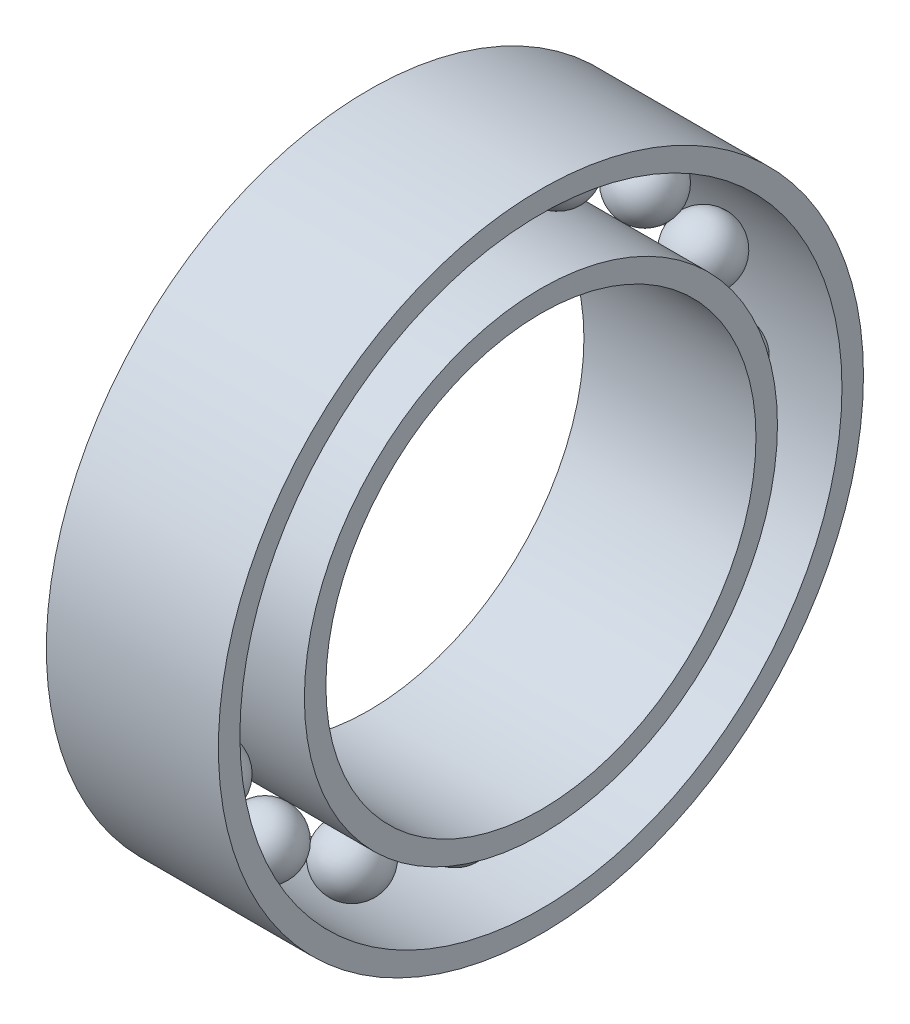
ISO-10303-21;
HEADER;
FILE_DESCRIPTION(('STEP AP214'),'2;1');
FILE_NAME('part.step','',(''),(''),'','','');
FILE_SCHEMA(('AUTOMOTIVE_DESIGN { 1 0 10303 214 1 1 1 1 }'));
ENDSEC;
DATA;
#1=APPLICATION_CONTEXT('core data for automotive mechanical design processes');
#2=APPLICATION_PROTOCOL_DEFINITION('international standard','automotive_design',2000,#1);
#3=PRODUCT_CONTEXT('',#1,'mechanical');
#4=PRODUCT('Part','Part','',(#3));
#5=PRODUCT_RELATED_PRODUCT_CATEGORY('part','',(#4));
#6=PRODUCT_DEFINITION_FORMATION('','',#4);
#7=PRODUCT_DEFINITION_CONTEXT('part definition',#1,'design');
#8=PRODUCT_DEFINITION('design','',#6,#7);
#9=PRODUCT_DEFINITION_SHAPE('','',#8);
#10=(LENGTH_UNIT() NAMED_UNIT(*) SI_UNIT(.MILLI.,.METRE.));
#11=(NAMED_UNIT(*) PLANE_ANGLE_UNIT() SI_UNIT($,.RADIAN.));
#12=(NAMED_UNIT(*) SI_UNIT($,.STERADIAN.) SOLID_ANGLE_UNIT());
#13=UNCERTAINTY_MEASURE_WITH_UNIT(LENGTH_MEASURE(1.E-05),#10,'distance_accuracy_value','');
#14=(GEOMETRIC_REPRESENTATION_CONTEXT(3) GLOBAL_UNCERTAINTY_ASSIGNED_CONTEXT((#13)) GLOBAL_UNIT_ASSIGNED_CONTEXT((#10,
#11,#12)) REPRESENTATION_CONTEXT('',''));
#15=CARTESIAN_POINT('',(0.,0.,0.));
#16=DIRECTION('',(0.,0.,1.));
#17=DIRECTION('',(1.,0.,0.));
#18=AXIS2_PLACEMENT_3D('',#15,#16,#17);
#19=CARTESIAN_POINT('',(0.,5.77424707819557,-2.39177145228173));
#20=DIRECTION('',(0.,0.923879532511292,-0.382683432365077));
#21=DIRECTION('',(0.,-0.382683432365077,-0.923879532511292));
#22=AXIS2_PLACEMENT_3D('',#19,#20,#21);
#23=SPHERICAL_SURFACE('',#22,0.750000000000001);
#24=CARTESIAN_POINT('',(0.,6.46715672757905,-2.67878402655554));
#25=VERTEX_POINT('',#24);
#26=VERTEX_LOOP('',#25);
#27=FACE_BOUND('',#26,.T.);
#28=ADVANCED_FACE('F51',(#27),#23,.T.);
#29=CLOSED_SHELL('',(#28));
#30=MANIFOLD_SOLID_BREP('B2',#29);
#31=CARTESIAN_POINT('',(0.,4.41941738241598,-4.41941738241587));
#32=DIRECTION('',(0.,0.707106781186556,-0.707106781186539));
#33=DIRECTION('',(0.,-0.707106781186539,-0.707106781186556));
#34=AXIS2_PLACEMENT_3D('',#31,#32,#33);
#35=SPHERICAL_SURFACE('',#34,0.750000000000001);
#36=CARTESIAN_POINT('',(0.,4.94974746830589,-4.94974746830577));
#37=VERTEX_POINT('',#36);
#38=VERTEX_LOOP('',#37);
#39=FACE_BOUND('',#38,.T.);
#40=ADVANCED_FACE('F69',(#39),#35,.T.);
#41=CLOSED_SHELL('',(#40));
#42=MANIFOLD_SOLID_BREP('B7',#41);
#43=CARTESIAN_POINT('',(0.,2.39177145228187,-5.77424707819552));
#44=DIRECTION('',(0.,0.3826834323651,-0.923879532511283));
#45=DIRECTION('',(0.,-0.923879532511283,-0.3826834323651));
#46=AXIS2_PLACEMENT_3D('',#43,#44,#45);
#47=SPHERICAL_SURFACE('',#46,0.750000000000001);
#48=CARTESIAN_POINT('',(0.,2.6787840265557,-6.46715672757898));
#49=VERTEX_POINT('',#48);
#50=VERTEX_LOOP('',#49);
#51=FACE_BOUND('',#50,.T.);
#52=ADVANCED_FACE('F87',(#51),#47,.T.);
#53=CLOSED_SHELL('',(#52));
#54=MANIFOLD_SOLID_BREP('B47',#53);
#55=CARTESIAN_POINT('',(0.,0.,-6.25));
#56=DIRECTION('',(0.,0.,-1.));
#57=DIRECTION('',(0.,-1.,0.));
#58=AXIS2_PLACEMENT_3D('',#55,#56,#57);
#59=SPHERICAL_SURFACE('',#58,0.750000000000001);
#60=CARTESIAN_POINT('',(0.,0.,-7.));
#61=VERTEX_POINT('',#60);
#62=VERTEX_LOOP('',#61);
#63=FACE_BOUND('',#62,.T.);
#64=ADVANCED_FACE('F105',(#63),#59,.T.);
#65=CLOSED_SHELL('',(#64));
#66=MANIFOLD_SOLID_BREP('B65',#65);
#67=CARTESIAN_POINT('',(0.,-2.39177145228175,-5.77424707819557));
#68=DIRECTION('',(0.,-0.382683432365081,-0.923879532511291));
#69=DIRECTION('',(0.,-0.923879532511291,0.382683432365081));
#70=AXIS2_PLACEMENT_3D('',#67,#68,#69);
#71=SPHERICAL_SURFACE('',#70,0.750000000000001);
#72=CARTESIAN_POINT('',(0.,-2.67878402655556,-6.46715672757904));
#73=VERTEX_POINT('',#72);
#74=VERTEX_LOOP('',#73);
#75=FACE_BOUND('',#74,.T.);
#76=ADVANCED_FACE('F123',(#75),#71,.T.);
#77=CLOSED_SHELL('',(#76));
#78=MANIFOLD_SOLID_BREP('B83',#77);
#79=CARTESIAN_POINT('',(0.,-4.41941738241588,-4.41941738241596));
#80=DIRECTION('',(0.,-0.707106781186541,-0.707106781186554));
#81=DIRECTION('',(0.,-0.707106781186554,0.707106781186541));
#82=AXIS2_PLACEMENT_3D('',#79,#80,#81);
#83=SPHERICAL_SURFACE('',#82,0.750000000000001);
#84=CARTESIAN_POINT('',(0.,-4.94974746830579,-4.94974746830588));
#85=VERTEX_POINT('',#84);
#86=VERTEX_LOOP('',#85);
#87=FACE_BOUND('',#86,.T.);
#88=ADVANCED_FACE('F141',(#87),#83,.T.);
#89=CLOSED_SHELL('',(#88));
#90=MANIFOLD_SOLID_BREP('B101',#89);
#91=CARTESIAN_POINT('',(0.,-5.77424707819552,-2.39177145228186));
#92=DIRECTION('',(0.,-0.923879532511284,-0.382683432365097));
#93=DIRECTION('',(0.,-0.382683432365097,0.923879532511284));
#94=AXIS2_PLACEMENT_3D('',#91,#92,#93);
#95=SPHERICAL_SURFACE('',#94,0.750000000000001);
#96=CARTESIAN_POINT('',(0.,-6.46715672757899,-2.67878402655568));
#97=VERTEX_POINT('',#96);
#98=VERTEX_LOOP('',#97);
#99=FACE_BOUND('',#98,.T.);
#100=ADVANCED_FACE('F159',(#99),#95,.T.);
#101=CLOSED_SHELL('',(#100));
#102=MANIFOLD_SOLID_BREP('B119',#101);
#103=CARTESIAN_POINT('',(0.,-6.25,0.));
#104=DIRECTION('',(0.,-1.,0.));
#105=DIRECTION('',(0.,0.,1.));
#106=AXIS2_PLACEMENT_3D('',#103,#104,#105);
#107=SPHERICAL_SURFACE('',#106,0.750000000000001);
#108=CARTESIAN_POINT('',(0.,-7.,0.));
#109=VERTEX_POINT('',#108);
#110=VERTEX_LOOP('',#109);
#111=FACE_BOUND('',#110,.T.);
#112=ADVANCED_FACE('F177',(#111),#107,.T.);
#113=CLOSED_SHELL('',(#112));
#114=MANIFOLD_SOLID_BREP('B137',#113);
#115=CARTESIAN_POINT('',(0.,-5.77424707819556,2.39177145228178));
#116=DIRECTION('',(0.,-0.923879532511289,0.382683432365084));
#117=DIRECTION('',(0.,0.382683432365084,0.923879532511289));
#118=AXIS2_PLACEMENT_3D('',#115,#116,#117);
#119=SPHERICAL_SURFACE('',#118,0.750000000000001);
#120=CARTESIAN_POINT('',(0.,-6.46715672757902,2.67878402655559));
#121=VERTEX_POINT('',#120);
#122=VERTEX_LOOP('',#121);
#123=FACE_BOUND('',#122,.T.);
#124=ADVANCED_FACE('F195',(#123),#119,.T.);
#125=CLOSED_SHELL('',(#124));
#126=MANIFOLD_SOLID_BREP('B155',#125);
#127=CARTESIAN_POINT('',(0.,-4.41941738241595,4.4194173824159));
#128=DIRECTION('',(0.,-0.707106781186551,0.707106781186544));
#129=DIRECTION('',(0.,0.707106781186544,0.707106781186551));
#130=AXIS2_PLACEMENT_3D('',#127,#128,#129);
#131=SPHERICAL_SURFACE('',#130,0.750000000000001);
#132=CARTESIAN_POINT('',(0.,-4.94974746830586,4.94974746830581));
#133=VERTEX_POINT('',#132);
#134=VERTEX_LOOP('',#133);
#135=FACE_BOUND('',#134,.T.);
#136=ADVANCED_FACE('F213',(#135),#131,.T.);
#137=CLOSED_SHELL('',(#136));
#138=MANIFOLD_SOLID_BREP('B173',#137);
#139=CARTESIAN_POINT('',(0.,-2.39177145228184,5.77424707819553));
#140=DIRECTION('',(0.,-0.382683432365094,0.923879532511285));
#141=DIRECTION('',(0.,0.923879532511285,0.382683432365094));
#142=AXIS2_PLACEMENT_3D('',#139,#140,#141);
#143=SPHERICAL_SURFACE('',#142,0.750000000000001);
#144=CARTESIAN_POINT('',(0.,-2.67878402655566,6.467156727579));
#145=VERTEX_POINT('',#144);
#146=VERTEX_LOOP('',#145);
#147=FACE_BOUND('',#146,.T.);
#148=ADVANCED_FACE('F231',(#147),#143,.T.);
#149=CLOSED_SHELL('',(#148));
#150=MANIFOLD_SOLID_BREP('B191',#149);
#151=CARTESIAN_POINT('',(0.,0.,6.25));
#152=DIRECTION('',(0.,0.,1.));
#153=DIRECTION('',(0.,1.,0.));
#154=AXIS2_PLACEMENT_3D('',#151,#152,#153);
#155=SPHERICAL_SURFACE('',#154,0.750000000000001);
#156=CARTESIAN_POINT('',(0.,0.,7.));
#157=VERTEX_POINT('',#156);
#158=VERTEX_LOOP('',#157);
#159=FACE_BOUND('',#158,.T.);
#160=ADVANCED_FACE('F249',(#159),#155,.T.);
#161=CLOSED_SHELL('',(#160));
#162=MANIFOLD_SOLID_BREP('B209',#161);
#163=CARTESIAN_POINT('',(0.,2.3917714522818,5.77424707819555));
#164=DIRECTION('',(0.,0.382683432365087,0.923879532511288));
#165=DIRECTION('',(0.,0.923879532511288,-0.382683432365087));
#166=AXIS2_PLACEMENT_3D('',#163,#164,#165);
#167=SPHERICAL_SURFACE('',#166,0.750000000000001);
#168=CARTESIAN_POINT('',(0.,2.67878402655561,6.46715672757901));
#169=VERTEX_POINT('',#168);
#170=VERTEX_LOOP('',#169);
#171=FACE_BOUND('',#170,.T.);
#172=ADVANCED_FACE('F267',(#171),#167,.T.);
#173=CLOSED_SHELL('',(#172));
#174=MANIFOLD_SOLID_BREP('B227',#173);
#175=CARTESIAN_POINT('',(0.,4.41941738241592,4.41941738241593));
#176=DIRECTION('',(0.,0.707106781186546,0.707106781186549));
#177=DIRECTION('',(0.,0.707106781186549,-0.707106781186546));
#178=AXIS2_PLACEMENT_3D('',#175,#176,#177);
#179=SPHERICAL_SURFACE('',#178,0.750000000000001);
#180=CARTESIAN_POINT('',(0.,4.94974746830583,4.94974746830584));
#181=VERTEX_POINT('',#180);
#182=VERTEX_LOOP('',#181);
#183=FACE_BOUND('',#182,.T.);
#184=ADVANCED_FACE('F285',(#183),#179,.T.);
#185=CLOSED_SHELL('',(#184));
#186=MANIFOLD_SOLID_BREP('B245',#185);
#187=CARTESIAN_POINT('',(0.,5.77424707819554,2.39177145228182));
#188=DIRECTION('',(0.,0.923879532511287,0.382683432365091));
#189=DIRECTION('',(0.,0.382683432365091,-0.923879532511287));
#190=AXIS2_PLACEMENT_3D('',#187,#188,#189);
#191=SPHERICAL_SURFACE('',#190,0.750000000000001);
#192=CARTESIAN_POINT('',(0.,6.46715672757901,2.67878402655564));
#193=VERTEX_POINT('',#192);
#194=VERTEX_LOOP('',#193);
#195=FACE_BOUND('',#194,.T.);
#196=ADVANCED_FACE('F305',(#195),#191,.T.);
#197=CLOSED_SHELL('',(#196));
#198=MANIFOLD_SOLID_BREP('B263',#197);
#199=CARTESIAN_POINT('',(-2.,0.,0.));
#200=DIRECTION('',(1.,0.,0.));
#201=DIRECTION('',(0.,0.,-1.));
#202=AXIS2_PLACEMENT_3D('',#199,#200,#201);
#203=CYLINDRICAL_SURFACE('',#202,7.);
#204=CARTESIAN_POINT('',(-2.,0.,0.));
#205=DIRECTION('',(1.,0.,0.));
#206=DIRECTION('',(0.,0.,-1.));
#207=AXIS2_PLACEMENT_3D('',#204,#205,#206);
#208=CIRCLE('',#207,7.);
#209=CARTESIAN_POINT('',(-2.,0.,-7.));
#210=VERTEX_POINT('',#209);
#211=EDGE_CURVE('E331',#210,#210,#208,.T.);
#212=ORIENTED_EDGE('',*,*,#211,.F.);
#213=EDGE_LOOP('',(#212));
#214=FACE_BOUND('',#213,.T.);
#215=CARTESIAN_POINT('',(2.,0.,0.));
#216=DIRECTION('',(1.,0.,0.));
#217=DIRECTION('',(0.,0.,-1.));
#218=AXIS2_PLACEMENT_3D('',#215,#216,#217);
#219=CIRCLE('',#218,7.);
#220=CARTESIAN_POINT('',(2.,0.,-7.));
#221=VERTEX_POINT('',#220);
#222=EDGE_CURVE('E339',#221,#221,#219,.T.);
#223=ORIENTED_EDGE('',*,*,#222,.T.);
#224=EDGE_LOOP('',(#223));
#225=FACE_BOUND('',#224,.T.);
#226=ADVANCED_FACE('F325',(#214,#225),#203,.F.);
#227=CARTESIAN_POINT('',(-2.,0.,0.));
#228=DIRECTION('',(1.,0.,0.));
#229=DIRECTION('',(0.,0.,-1.));
#230=AXIS2_PLACEMENT_3D('',#227,#228,#229);
#231=CYLINDRICAL_SURFACE('',#230,7.5);
#232=CARTESIAN_POINT('',(-2.,0.,0.));
#233=DIRECTION('',(1.,0.,0.));
#234=DIRECTION('',(0.,0.,-1.));
#235=AXIS2_PLACEMENT_3D('',#232,#233,#234);
#236=CIRCLE('',#235,7.5);
#237=CARTESIAN_POINT('',(-2.,0.,-7.5));
#238=VERTEX_POINT('',#237);
#239=EDGE_CURVE('E304',#238,#238,#236,.T.);
#240=ORIENTED_EDGE('',*,*,#239,.T.);
#241=EDGE_LOOP('',(#240));
#242=FACE_BOUND('',#241,.T.);
#243=CARTESIAN_POINT('',(2.,0.,0.));
#244=DIRECTION('',(1.,0.,0.));
#245=DIRECTION('',(0.,0.,-1.));
#246=AXIS2_PLACEMENT_3D('',#243,#244,#245);
#247=CIRCLE('',#246,7.5);
#248=CARTESIAN_POINT('',(2.,0.,-7.5));
#249=VERTEX_POINT('',#248);
#250=EDGE_CURVE('E335',#249,#249,#247,.T.);
#251=ORIENTED_EDGE('',*,*,#250,.F.);
#252=EDGE_LOOP('',(#251));
#253=FACE_BOUND('',#252,.T.);
#254=ADVANCED_FACE('F353',(#242,#253),#231,.T.);
#255=CARTESIAN_POINT('',(-2.,0.,0.));
#256=DIRECTION('',(1.,0.,0.));
#257=DIRECTION('',(0.,0.,-1.));
#258=AXIS2_PLACEMENT_3D('',#255,#256,#257);
#259=PLANE('',#258);
#260=ORIENTED_EDGE('',*,*,#211,.T.);
#261=EDGE_LOOP('',(#260));
#262=FACE_BOUND('',#261,.T.);
#263=ORIENTED_EDGE('',*,*,#239,.F.);
#264=EDGE_LOOP('',(#263));
#265=FACE_BOUND('',#264,.T.);
#266=ADVANCED_FACE('F349',(#262,#265),#259,.F.);
#267=CARTESIAN_POINT('',(2.,0.,0.));
#268=DIRECTION('',(1.,0.,0.));
#269=DIRECTION('',(0.,0.,-1.));
#270=AXIS2_PLACEMENT_3D('',#267,#268,#269);
#271=PLANE('',#270);
#272=ORIENTED_EDGE('',*,*,#222,.F.);
#273=EDGE_LOOP('',(#272));
#274=FACE_BOUND('',#273,.T.);
#275=ORIENTED_EDGE('',*,*,#250,.T.);
#276=EDGE_LOOP('',(#275));
#277=FACE_BOUND('',#276,.T.);
#278=ADVANCED_FACE('F346',(#274,#277),#271,.T.);
#279=CLOSED_SHELL('',(#226,#254,#266,#278));
#280=MANIFOLD_SOLID_BREP('B281',#279);
#281=CARTESIAN_POINT('',(-2.,0.,0.));
#282=DIRECTION('',(1.,0.,0.));
#283=DIRECTION('',(0.,0.,-1.));
#284=AXIS2_PLACEMENT_3D('',#281,#282,#283);
#285=CYLINDRICAL_SURFACE('',#284,5.);
#286=CARTESIAN_POINT('',(-2.,0.,0.));
#287=DIRECTION('',(1.,0.,0.));
#288=DIRECTION('',(0.,0.,-1.));
#289=AXIS2_PLACEMENT_3D('',#286,#287,#288);
#290=CIRCLE('',#289,5.);
#291=CARTESIAN_POINT('',(-2.,0.,-5.));
#292=VERTEX_POINT('',#291);
#293=EDGE_CURVE('E397',#292,#292,#290,.T.);
#294=ORIENTED_EDGE('',*,*,#293,.F.);
#295=EDGE_LOOP('',(#294));
#296=FACE_BOUND('',#295,.T.);
#297=CARTESIAN_POINT('',(2.,0.,0.));
#298=DIRECTION('',(1.,0.,0.));
#299=DIRECTION('',(0.,0.,-1.));
#300=AXIS2_PLACEMENT_3D('',#297,#298,#299);
#301=CIRCLE('',#300,5.);
#302=CARTESIAN_POINT('',(2.,0.,-5.));
#303=VERTEX_POINT('',#302);
#304=EDGE_CURVE('E405',#303,#303,#301,.T.);
#305=ORIENTED_EDGE('',*,*,#304,.T.);
#306=EDGE_LOOP('',(#305));
#307=FACE_BOUND('',#306,.T.);
#308=ADVANCED_FACE('F391',(#296,#307),#285,.F.);
#309=CARTESIAN_POINT('',(-2.,0.,0.));
#310=DIRECTION('',(1.,0.,0.));
#311=DIRECTION('',(0.,0.,-1.));
#312=AXIS2_PLACEMENT_3D('',#309,#310,#311);
#313=CYLINDRICAL_SURFACE('',#312,5.5);
#314=CARTESIAN_POINT('',(-2.,0.,0.));
#315=DIRECTION('',(1.,0.,0.));
#316=DIRECTION('',(0.,0.,-1.));
#317=AXIS2_PLACEMENT_3D('',#314,#315,#316);
#318=CIRCLE('',#317,5.5);
#319=CARTESIAN_POINT('',(-2.,0.,-5.5));
#320=VERTEX_POINT('',#319);
#321=EDGE_CURVE('E324',#320,#320,#318,.T.);
#322=ORIENTED_EDGE('',*,*,#321,.T.);
#323=EDGE_LOOP('',(#322));
#324=FACE_BOUND('',#323,.T.);
#325=CARTESIAN_POINT('',(2.,0.,0.));
#326=DIRECTION('',(1.,0.,0.));
#327=DIRECTION('',(0.,0.,-1.));
#328=AXIS2_PLACEMENT_3D('',#325,#326,#327);
#329=CIRCLE('',#328,5.5);
#330=CARTESIAN_POINT('',(2.,0.,-5.5));
#331=VERTEX_POINT('',#330);
#332=EDGE_CURVE('E401',#331,#331,#329,.T.);
#333=ORIENTED_EDGE('',*,*,#332,.F.);
#334=EDGE_LOOP('',(#333));
#335=FACE_BOUND('',#334,.T.);
#336=ADVANCED_FACE('F419',(#324,#335),#313,.T.);
#337=CARTESIAN_POINT('',(-2.,0.,0.));
#338=DIRECTION('',(1.,0.,0.));
#339=DIRECTION('',(0.,0.,-1.));
#340=AXIS2_PLACEMENT_3D('',#337,#338,#339);
#341=PLANE('',#340);
#342=ORIENTED_EDGE('',*,*,#293,.T.);
#343=EDGE_LOOP('',(#342));
#344=FACE_BOUND('',#343,.T.);
#345=ORIENTED_EDGE('',*,*,#321,.F.);
#346=EDGE_LOOP('',(#345));
#347=FACE_BOUND('',#346,.T.);
#348=ADVANCED_FACE('F415',(#344,#347),#341,.F.);
#349=CARTESIAN_POINT('',(2.,0.,0.));
#350=DIRECTION('',(1.,0.,0.));
#351=DIRECTION('',(0.,0.,-1.));
#352=AXIS2_PLACEMENT_3D('',#349,#350,#351);
#353=PLANE('',#352);
#354=ORIENTED_EDGE('',*,*,#304,.F.);
#355=EDGE_LOOP('',(#354));
#356=FACE_BOUND('',#355,.T.);
#357=ORIENTED_EDGE('',*,*,#332,.T.);
#358=EDGE_LOOP('',(#357));
#359=FACE_BOUND('',#358,.T.);
#360=ADVANCED_FACE('F412',(#356,#359),#353,.T.);
#361=CLOSED_SHELL('',(#308,#336,#348,#360));
#362=MANIFOLD_SOLID_BREP('B299',#361);
#363=CARTESIAN_POINT('',(0.,6.25,0.));
#364=DIRECTION('',(0.,1.,0.));
#365=DIRECTION('',(0.,0.,-1.));
#366=AXIS2_PLACEMENT_3D('',#363,#364,#365);
#367=SPHERICAL_SURFACE('',#366,0.750000000000001);
#368=CARTESIAN_POINT('',(0.,7.,0.));
#369=VERTEX_POINT('',#368);
#370=VERTEX_LOOP('',#369);
#371=FACE_BOUND('',#370,.T.);
#372=ADVANCED_FACE('F452',(#371),#367,.T.);
#373=CLOSED_SHELL('',(#372));
#374=MANIFOLD_SOLID_BREP('B319',#373);
#375=ADVANCED_BREP_SHAPE_REPRESENTATION('',(#18,#30,#42,#54,#66,#78,#90,#102,#114,#126,#138,
#150,#162,#174,#186,#198,#280,#362,#374),#14);
#376=SHAPE_DEFINITION_REPRESENTATION(#9,#375);
ENDSEC;
END-ISO-10303-21;
